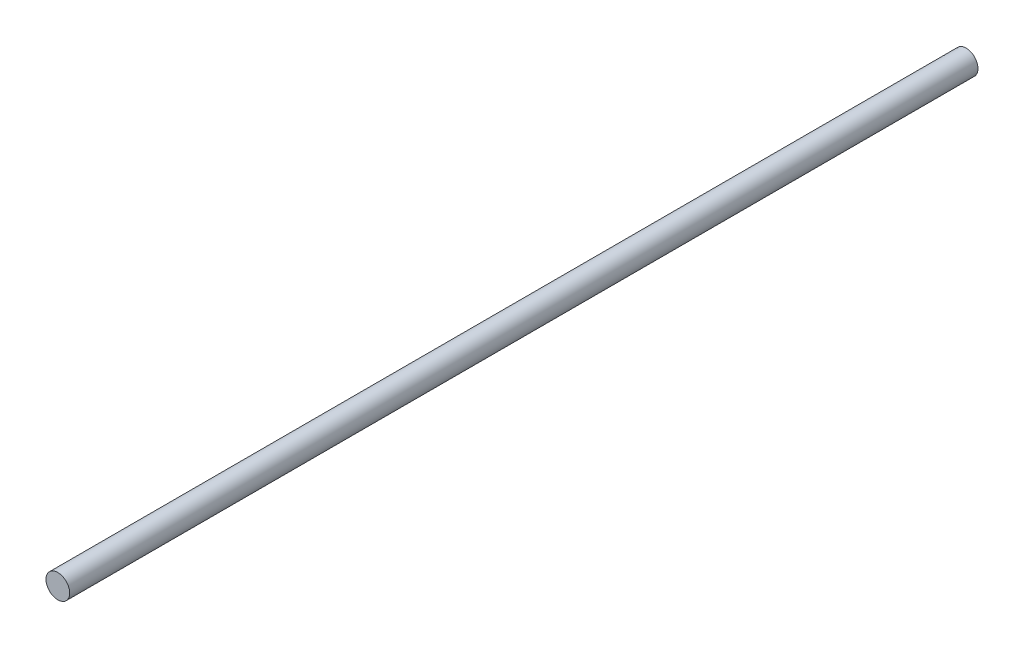
ISO-10303-21;
HEADER;
FILE_DESCRIPTION(('STEP AP214'),'2;1');
FILE_NAME('part.step','',(''),(''),'','','');
FILE_SCHEMA(('AUTOMOTIVE_DESIGN { 1 0 10303 214 1 1 1 1 }'));
ENDSEC;
DATA;
#1=APPLICATION_CONTEXT('core data for automotive mechanical design processes');
#2=APPLICATION_PROTOCOL_DEFINITION('international standard','automotive_design',2000,#1);
#3=PRODUCT_CONTEXT('',#1,'mechanical');
#4=PRODUCT('Part','Part','',(#3));
#5=PRODUCT_RELATED_PRODUCT_CATEGORY('part','',(#4));
#6=PRODUCT_DEFINITION_FORMATION('','',#4);
#7=PRODUCT_DEFINITION_CONTEXT('part definition',#1,'design');
#8=PRODUCT_DEFINITION('design','',#6,#7);
#9=PRODUCT_DEFINITION_SHAPE('','',#8);
#10=(LENGTH_UNIT() NAMED_UNIT(*) SI_UNIT(.MILLI.,.METRE.));
#11=(NAMED_UNIT(*) PLANE_ANGLE_UNIT() SI_UNIT($,.RADIAN.));
#12=(NAMED_UNIT(*) SI_UNIT($,.STERADIAN.) SOLID_ANGLE_UNIT());
#13=UNCERTAINTY_MEASURE_WITH_UNIT(LENGTH_MEASURE(1.E-05),#10,'distance_accuracy_value','');
#14=(GEOMETRIC_REPRESENTATION_CONTEXT(3) GLOBAL_UNCERTAINTY_ASSIGNED_CONTEXT((#13)) GLOBAL_UNIT_ASSIGNED_CONTEXT((#10,
#11,#12)) REPRESENTATION_CONTEXT('',''));
#15=CARTESIAN_POINT('',(0.,0.,0.));
#16=DIRECTION('',(0.,0.,1.));
#17=DIRECTION('',(1.,0.,0.));
#18=AXIS2_PLACEMENT_3D('',#15,#16,#17);
#19=CARTESIAN_POINT('',(0.,0.,460.));
#20=DIRECTION('',(0.,0.,-1.));
#21=DIRECTION('',(-1.,0.,0.));
#22=AXIS2_PLACEMENT_3D('',#19,#20,#21);
#23=CYLINDRICAL_SURFACE('',#22,6.);
#24=CARTESIAN_POINT('',(0.,0.,460.));
#25=DIRECTION('',(0.,0.,1.));
#26=DIRECTION('',(1.,0.,0.));
#27=AXIS2_PLACEMENT_3D('',#24,#25,#26);
#28=CIRCLE('',#27,6.);
#29=CARTESIAN_POINT('',(6.,0.,460.));
#30=VERTEX_POINT('',#29);
#31=EDGE_CURVE('E10',#30,#30,#28,.T.);
#32=ORIENTED_EDGE('',*,*,#31,.F.);
#33=EDGE_LOOP('',(#32));
#34=FACE_BOUND('',#33,.T.);
#35=CARTESIAN_POINT('',(0.,0.,0.));
#36=DIRECTION('',(0.,0.,1.));
#37=DIRECTION('',(1.,0.,0.));
#38=AXIS2_PLACEMENT_3D('',#35,#36,#37);
#39=CIRCLE('',#38,6.);
#40=CARTESIAN_POINT('',(6.,0.,0.));
#41=VERTEX_POINT('',#40);
#42=EDGE_CURVE('E36',#41,#41,#39,.T.);
#43=ORIENTED_EDGE('',*,*,#42,.T.);
#44=EDGE_LOOP('',(#43));
#45=FACE_BOUND('',#44,.T.);
#46=ADVANCED_FACE('F33',(#34,#45),#23,.T.);
#47=CARTESIAN_POINT('',(0.,0.,460.));
#48=DIRECTION('',(0.,0.,1.));
#49=DIRECTION('',(1.,0.,0.));
#50=AXIS2_PLACEMENT_3D('',#47,#48,#49);
#51=PLANE('',#50);
#52=ORIENTED_EDGE('',*,*,#31,.T.);
#53=EDGE_LOOP('',(#52));
#54=FACE_BOUND('',#53,.T.);
#55=ADVANCED_FACE('F48',(#54),#51,.T.);
#56=CARTESIAN_POINT('',(0.,0.,0.));
#57=DIRECTION('',(0.,0.,1.));
#58=DIRECTION('',(1.,0.,0.));
#59=AXIS2_PLACEMENT_3D('',#56,#57,#58);
#60=PLANE('',#59);
#61=ORIENTED_EDGE('',*,*,#42,.F.);
#62=EDGE_LOOP('',(#61));
#63=FACE_BOUND('',#62,.T.);
#64=ADVANCED_FACE('F46',(#63),#60,.F.);
#65=CLOSED_SHELL('',(#46,#55,#64));
#66=MANIFOLD_SOLID_BREP('B2',#65);
#67=ADVANCED_BREP_SHAPE_REPRESENTATION('',(#18,#66),#14);
#68=SHAPE_DEFINITION_REPRESENTATION(#9,#67);
ENDSEC;
END-ISO-10303-21;
